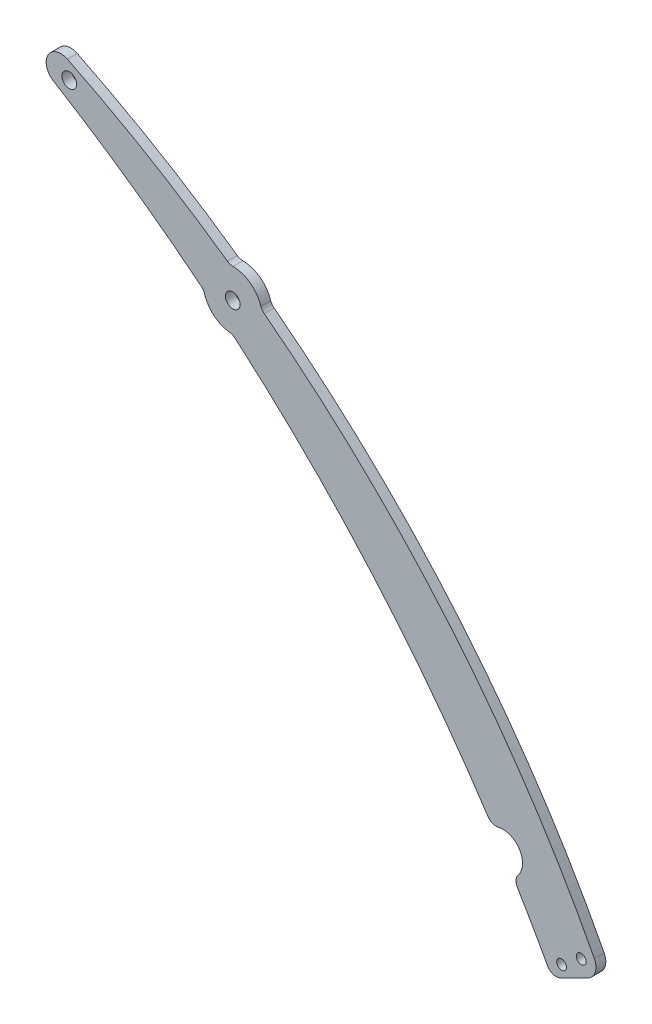
ISO-10303-21;
HEADER;
FILE_DESCRIPTION(('STEP AP214'),'2;1');
FILE_NAME('part.step','',(''),(''),'','','');
FILE_SCHEMA(('AUTOMOTIVE_DESIGN { 1 0 10303 214 1 1 1 1 }'));
ENDSEC;
DATA;
#1=APPLICATION_CONTEXT('core data for automotive mechanical design processes');
#2=APPLICATION_PROTOCOL_DEFINITION('international standard','automotive_design',2000,#1);
#3=PRODUCT_CONTEXT('',#1,'mechanical');
#4=PRODUCT('Part','Part','',(#3));
#5=PRODUCT_RELATED_PRODUCT_CATEGORY('part','',(#4));
#6=PRODUCT_DEFINITION_FORMATION('','',#4);
#7=PRODUCT_DEFINITION_CONTEXT('part definition',#1,'design');
#8=PRODUCT_DEFINITION('design','',#6,#7);
#9=PRODUCT_DEFINITION_SHAPE('','',#8);
#10=(LENGTH_UNIT() NAMED_UNIT(*) SI_UNIT(.MILLI.,.METRE.));
#11=(NAMED_UNIT(*) PLANE_ANGLE_UNIT() SI_UNIT($,.RADIAN.));
#12=(NAMED_UNIT(*) SI_UNIT($,.STERADIAN.) SOLID_ANGLE_UNIT());
#13=UNCERTAINTY_MEASURE_WITH_UNIT(LENGTH_MEASURE(1.E-05),#10,'distance_accuracy_value','');
#14=(GEOMETRIC_REPRESENTATION_CONTEXT(3) GLOBAL_UNCERTAINTY_ASSIGNED_CONTEXT((#13)) GLOBAL_UNIT_ASSIGNED_CONTEXT((#10,
#11,#12)) REPRESENTATION_CONTEXT('',''));
#15=CARTESIAN_POINT('',(0.,0.,0.));
#16=DIRECTION('',(0.,0.,1.));
#17=DIRECTION('',(1.,0.,0.));
#18=AXIS2_PLACEMENT_3D('',#15,#16,#17);
#19=CARTESIAN_POINT('',(-270.261862032767,-373.864528864417,3.));
#20=DIRECTION('',(0.,0.,-1.));
#21=DIRECTION('',(-1.,0.,0.));
#22=AXIS2_PLACEMENT_3D('',#19,#20,#21);
#23=PLANE('',#22);
#24=CARTESIAN_POINT('',(-57.9676307244706,49.9667264958207,3.));
#25=DIRECTION('',(0.,0.,1.));
#26=DIRECTION('',(1.,0.,0.));
#27=AXIS2_PLACEMENT_3D('',#24,#25,#26);
#28=CIRCLE('',#27,3.);
#29=CARTESIAN_POINT('',(-54.9676307244706,49.9667264958207,3.));
#30=VERTEX_POINT('',#29);
#31=EDGE_CURVE('E370',#30,#30,#28,.T.);
#32=ORIENTED_EDGE('',*,*,#31,.F.);
#33=EDGE_LOOP('',(#32));
#34=FACE_BOUND('',#33,.T.);
#35=CARTESIAN_POINT('',(-270.261862032767,-373.864528864417,3.));
#36=DIRECTION('',(0.,0.,1.));
#37=DIRECTION('',(-1.,0.,0.));
#38=AXIS2_PLACEMENT_3D('',#35,#36,#37);
#39=CIRCLE('',#38,480.);
#40=CARTESIAN_POINT('',(6.43434574327649,18.3588878286158,3.));
#41=VERTEX_POINT('',#40);
#42=CARTESIAN_POINT('',(-58.7344774433436,57.0138363023177,3.));
#43=VERTEX_POINT('',#42);
#44=EDGE_CURVE('E233',#41,#43,#39,.T.);
#45=ORIENTED_EDGE('',*,*,#44,.T.);
#46=CARTESIAN_POINT('',(-61.3785697507114,51.6278567377334,3.));
#47=DIRECTION('',(0.,0.,1.));
#48=DIRECTION('',(1.,0.,0.));
#49=AXIS2_PLACEMENT_3D('',#46,#47,#48);
#50=CIRCLE('',#49,6.00000000000005);
#51=CARTESIAN_POINT('',(-64.4959909119464,46.5012901183004,3.));
#52=VERTEX_POINT('',#51);
#53=EDGE_CURVE('E131',#43,#52,#50,.T.);
#54=ORIENTED_EDGE('',*,*,#53,.T.);
#55=CARTESIAN_POINT('',(-355.455299293874,-431.978261028778,3.));
#56=DIRECTION('',(0.,0.,-1.));
#57=DIRECTION('',(-1.,0.,0.));
#58=AXIS2_PLACEMENT_3D('',#55,#56,#57);
#59=CIRCLE('',#58,560.);
#60=CARTESIAN_POINT('',(-4.20028208191194,4.1638177522352,3.));
#61=VERTEX_POINT('',#60);
#62=EDGE_CURVE('E278',#52,#61,#59,.T.);
#63=ORIENTED_EDGE('',*,*,#62,.T.);
#64=CARTESIAN_POINT('',(-6.70924649056877,1.04851718951383,3.));
#65=DIRECTION('',(0.,0.,-1.));
#66=DIRECTION('',(1.,0.,0.));
#67=AXIS2_PLACEMENT_3D('',#64,#65,#66);
#68=CIRCLE('',#67,4.);
#69=CARTESIAN_POINT('',(-2.87657730560362,2.19335207656898,3.));
#70=VERTEX_POINT('',#69);
#71=EDGE_CURVE('E297',#61,#70,#68,.T.);
#72=ORIENTED_EDGE('',*,*,#71,.T.);
#73=CARTESIAN_POINT('',(8.62143024928856,5.62785673773342,3.));
#74=DIRECTION('',(0.,0.,1.));
#75=DIRECTION('',(1.,0.,0.));
#76=AXIS2_PLACEMENT_3D('',#73,#74,#75);
#77=CIRCLE('',#76,11.9999999999966);
#78=CARTESIAN_POINT('',(7.33579985629351,-6.30307593714681,3.));
#79=VERTEX_POINT('',#78);
#80=EDGE_CURVE('E294',#70,#79,#77,.T.);
#81=ORIENTED_EDGE('',*,*,#80,.T.);
#82=CARTESIAN_POINT('',(6.9072563919617,-10.2800534954413,3.));
#83=DIRECTION('',(0.,0.,-1.));
#84=DIRECTION('',(-1.,0.,0.));
#85=AXIS2_PLACEMENT_3D('',#82,#83,#84);
#86=CIRCLE('',#85,4.);
#87=CARTESIAN_POINT('',(9.51418125301089,-7.24625344124467,3.));
#88=VERTEX_POINT('',#87);
#89=EDGE_CURVE('E296',#79,#88,#86,.T.);
#90=ORIENTED_EDGE('',*,*,#89,.T.);
#91=CARTESIAN_POINT('',(-355.455299293874,-431.978261028778,3.));
#92=DIRECTION('',(0.,0.,-1.));
#93=DIRECTION('',(-1.,0.,0.));
#94=AXIS2_PLACEMENT_3D('',#91,#92,#93);
#95=CIRCLE('',#94,560.);
#96=CARTESIAN_POINT('',(112.524952292281,-124.416098002572,3.));
#97=VERTEX_POINT('',#96);
#98=EDGE_CURVE('E299',#88,#97,#95,.T.);
#99=ORIENTED_EDGE('',*,*,#98,.T.);
#100=CARTESIAN_POINT('',(115.867668375039,-122.219225409527,3.));
#101=DIRECTION('',(0.,0.,1.));
#102=DIRECTION('',(-1.,0.,0.));
#103=AXIS2_PLACEMENT_3D('',#100,#101,#102);
#104=CIRCLE('',#103,3.99999999999999);
#105=CARTESIAN_POINT('',(116.785588999789,-126.112478769721,3.));
#106=VERTEX_POINT('',#105);
#107=EDGE_CURVE('E305',#97,#106,#104,.T.);
#108=ORIENTED_EDGE('',*,*,#107,.T.);
#109=CARTESIAN_POINT('',(118.621430249289,-133.898985490108,3.));
#110=DIRECTION('',(0.,0.,-1.));
#111=DIRECTION('',(-1.,0.,0.));
#112=AXIS2_PLACEMENT_3D('',#109,#110,#111);
#113=CIRCLE('',#112,7.99999999999999);
#114=CARTESIAN_POINT('',(124.843287500004,-138.927751974219,3.));
#115=VERTEX_POINT('',#114);
#116=EDGE_CURVE('E307',#106,#115,#113,.T.);
#117=ORIENTED_EDGE('',*,*,#116,.T.);
#118=CARTESIAN_POINT('',(127.954216125362,-141.442135216274,3.));
#119=DIRECTION('',(0.,0.,1.));
#120=DIRECTION('',(1.,0.,0.));
#121=AXIS2_PLACEMENT_3D('',#118,#119,#120);
#122=CIRCLE('',#121,4.);
#123=CARTESIAN_POINT('',(124.525779845793,-143.502675115654,3.));
#124=VERTEX_POINT('',#123);
#125=EDGE_CURVE('E309',#115,#124,#122,.T.);
#126=ORIENTED_EDGE('',*,*,#125,.T.);
#127=CARTESIAN_POINT('',(-355.455299293874,-431.978261028778,3.));
#128=DIRECTION('',(0.,0.,-1.));
#129=DIRECTION('',(-1.,0.,0.));
#130=AXIS2_PLACEMENT_3D('',#127,#128,#129);
#131=CIRCLE('',#130,560.);
#132=CARTESIAN_POINT('',(136.784983157611,-164.958590719489,3.));
#133=VERTEX_POINT('',#132);
#134=EDGE_CURVE('E311',#124,#133,#131,.T.);
#135=ORIENTED_EDGE('',*,*,#134,.T.);
#136=CARTESIAN_POINT('',(140.300985175122,-163.051307360137,3.));
#137=DIRECTION('',(0.,0.,1.));
#138=DIRECTION('',(1.,0.,0.));
#139=AXIS2_PLACEMENT_3D('',#136,#137,#138);
#140=CIRCLE('',#139,4.);
#141=CARTESIAN_POINT('',(142.097183351543,-166.625334795821,3.));
#142=VERTEX_POINT('',#141);
#143=EDGE_CURVE('E313',#133,#142,#140,.T.);
#144=ORIENTED_EDGE('',*,*,#143,.T.);
#145=DIRECTION('',(0.893506858920949,0.449049544105347,0.));
#146=VECTOR('',#145,1.);
#147=CARTESIAN_POINT('',(153.226457096259,-161.032098155955,3.));
#148=LINE('',#147,#146);
#149=CARTESIAN_POINT('',(153.226457096259,-161.032098155955,3.));
#150=VERTEX_POINT('',#149);
#151=EDGE_CURVE('E315',#142,#150,#148,.T.);
#152=ORIENTED_EDGE('',*,*,#151,.T.);
#153=CARTESIAN_POINT('',(150.532159831627,-155.671057002429,3.));
#154=DIRECTION('',(0.,0.,1.));
#155=DIRECTION('',(-1.,0.,0.));
#156=AXIS2_PLACEMENT_3D('',#153,#154,#155);
#157=CIRCLE('',#156,5.99999999999998);
#158=CARTESIAN_POINT('',(155.858666437505,-152.909114320632,3.));
#159=VERTEX_POINT('',#158);
#160=EDGE_CURVE('E317',#150,#159,#157,.T.);
#161=ORIENTED_EDGE('',*,*,#160,.T.);
#162=CARTESIAN_POINT('',(-270.261862032767,-373.864528864417,3.));
#163=DIRECTION('',(0.,0.,1.));
#164=DIRECTION('',(-1.,0.,0.));
#165=AXIS2_PLACEMENT_3D('',#162,#163,#164);
#166=CIRCLE('',#165,480.);
#167=CARTESIAN_POINT('',(21.4246171394412,7.34276102931088,3.));
#168=VERTEX_POINT('',#167);
#169=EDGE_CURVE('E180',#159,#168,#166,.T.);
#170=ORIENTED_EDGE('',*,*,#169,.T.);
#171=CARTESIAN_POINT('',(23.8553377992097,10.519488445092,3.));
#172=DIRECTION('',(0.,0.,-1.));
#173=DIRECTION('',(-1.,0.,0.));
#174=AXIS2_PLACEMENT_3D('',#171,#172,#173);
#175=CIRCLE('',#174,4.);
#176=CARTESIAN_POINT('',(20.0468609117293,9.29658051825231,3.));
#177=VERTEX_POINT('',#176);
#178=EDGE_CURVE('E174',#168,#177,#175,.T.);
#179=ORIENTED_EDGE('',*,*,#178,.T.);
#180=CARTESIAN_POINT('',(8.62143024928856,5.62785673773342,3.));
#181=DIRECTION('',(0.,0.,1.));
#182=DIRECTION('',(1.,0.,0.));
#183=AXIS2_PLACEMENT_3D('',#180,#181,#182);
#184=CIRCLE('',#183,11.9999999999994);
#185=CARTESIAN_POINT('',(8.71046816837977,17.6275264102265,3.));
#186=VERTEX_POINT('',#185);
#187=EDGE_CURVE('E178',#177,#186,#184,.T.);
#188=ORIENTED_EDGE('',*,*,#187,.T.);
#189=CARTESIAN_POINT('',(8.74014747474351,21.6274163010577,3.));
#190=DIRECTION('',(0.,0.,-1.));
#191=DIRECTION('',(1.,0.,0.));
#192=AXIS2_PLACEMENT_3D('',#189,#190,#191);
#193=CIRCLE('',#192,4.);
#194=EDGE_CURVE('E58',#186,#41,#193,.T.);
#195=ORIENTED_EDGE('',*,*,#194,.T.);
#196=EDGE_LOOP('',(#45,#54,#63,#72,#81,#90,#99,#108,#117,#126,#135,#144,#152,#161,#170,#179,
#188,#195));
#197=FACE_BOUND('',#196,.T.);
#198=CARTESIAN_POINT('',(150.532159831627,-155.671057002429,3.));
#199=DIRECTION('',(0.,0.,1.));
#200=DIRECTION('',(1.,0.,0.));
#201=AXIS2_PLACEMENT_3D('',#198,#199,#200);
#202=CIRCLE('',#201,2.);
#203=CARTESIAN_POINT('',(152.532159831627,-155.671057002429,3.));
#204=VERTEX_POINT('',#203);
#205=EDGE_CURVE('E202',#204,#204,#202,.T.);
#206=ORIENTED_EDGE('',*,*,#205,.F.);
#207=EDGE_LOOP('',(#206));
#208=FACE_BOUND('',#207,.T.);
#209=CARTESIAN_POINT('',(142.532159831627,-161.671057002429,3.));
#210=DIRECTION('',(0.,0.,1.));
#211=DIRECTION('',(1.,0.,0.));
#212=AXIS2_PLACEMENT_3D('',#209,#210,#211);
#213=CIRCLE('',#212,2.);
#214=CARTESIAN_POINT('',(144.532159831627,-161.671057002429,3.));
#215=VERTEX_POINT('',#214);
#216=EDGE_CURVE('E381',#215,#215,#213,.T.);
#217=ORIENTED_EDGE('',*,*,#216,.F.);
#218=EDGE_LOOP('',(#217));
#219=FACE_BOUND('',#218,.T.);
#220=CARTESIAN_POINT('',(8.62143024928856,5.62785673773342,3.));
#221=DIRECTION('',(0.,0.,1.));
#222=DIRECTION('',(1.,0.,0.));
#223=AXIS2_PLACEMENT_3D('',#220,#221,#222);
#224=CIRCLE('',#223,3.00000000000001);
#225=CARTESIAN_POINT('',(11.6214302492886,5.62785673773342,3.));
#226=VERTEX_POINT('',#225);
#227=EDGE_CURVE('E375',#226,#226,#224,.T.);
#228=ORIENTED_EDGE('',*,*,#227,.F.);
#229=EDGE_LOOP('',(#228));
#230=FACE_BOUND('',#229,.T.);
#231=ADVANCED_FACE('F41',(#34,#197,#208,#219,#230),#23,.F.);
#232=CARTESIAN_POINT('',(-270.261862032767,-373.864528864417,-1.));
#233=DIRECTION('',(0.,0.,-1.));
#234=DIRECTION('',(-1.,0.,0.));
#235=AXIS2_PLACEMENT_3D('',#232,#233,#234);
#236=PLANE('',#235);
#237=CARTESIAN_POINT('',(-57.9676307244706,49.9667264958207,-0.999999999999997));
#238=DIRECTION('',(0.,0.,1.));
#239=DIRECTION('',(1.,0.,0.));
#240=AXIS2_PLACEMENT_3D('',#237,#238,#239);
#241=CIRCLE('',#240,3.);
#242=CARTESIAN_POINT('',(-54.9676307244706,49.9667264958207,-0.999999999999997));
#243=VERTEX_POINT('',#242);
#244=EDGE_CURVE('E368',#243,#243,#241,.T.);
#245=ORIENTED_EDGE('',*,*,#244,.T.);
#246=EDGE_LOOP('',(#245));
#247=FACE_BOUND('',#246,.T.);
#248=CARTESIAN_POINT('',(142.532159831627,-161.671057002429,-1.));
#249=DIRECTION('',(0.,0.,1.));
#250=DIRECTION('',(1.,0.,0.));
#251=AXIS2_PLACEMENT_3D('',#248,#249,#250);
#252=CIRCLE('',#251,2.);
#253=CARTESIAN_POINT('',(144.532159831627,-161.671057002429,-1.));
#254=VERTEX_POINT('',#253);
#255=EDGE_CURVE('E378',#254,#254,#252,.T.);
#256=ORIENTED_EDGE('',*,*,#255,.T.);
#257=EDGE_LOOP('',(#256));
#258=FACE_BOUND('',#257,.T.);
#259=CARTESIAN_POINT('',(-270.261862032767,-373.864528864417,-1.));
#260=DIRECTION('',(0.,0.,1.));
#261=DIRECTION('',(-1.,0.,0.));
#262=AXIS2_PLACEMENT_3D('',#259,#260,#261);
#263=CIRCLE('',#262,480.);
#264=CARTESIAN_POINT('',(6.43434574327649,18.3588878286158,-1.));
#265=VERTEX_POINT('',#264);
#266=CARTESIAN_POINT('',(-58.7344774433436,57.0138363023177,-1.));
#267=VERTEX_POINT('',#266);
#268=EDGE_CURVE('E198',#265,#267,#263,.T.);
#269=ORIENTED_EDGE('',*,*,#268,.F.);
#270=CARTESIAN_POINT('',(8.74014747474351,21.6274163010577,-1.));
#271=DIRECTION('',(0.,0.,-1.));
#272=DIRECTION('',(1.,0.,0.));
#273=AXIS2_PLACEMENT_3D('',#270,#271,#272);
#274=CIRCLE('',#273,4.);
#275=CARTESIAN_POINT('',(8.71046816837977,17.6275264102265,-1.));
#276=VERTEX_POINT('',#275);
#277=EDGE_CURVE('E123',#276,#265,#274,.T.);
#278=ORIENTED_EDGE('',*,*,#277,.F.);
#279=CARTESIAN_POINT('',(8.62143024928856,5.62785673773342,-1.));
#280=DIRECTION('',(0.,0.,1.));
#281=DIRECTION('',(1.,0.,0.));
#282=AXIS2_PLACEMENT_3D('',#279,#280,#281);
#283=CIRCLE('',#282,11.9999999999994);
#284=CARTESIAN_POINT('',(20.0468609117293,9.29658051825231,-1.));
#285=VERTEX_POINT('',#284);
#286=EDGE_CURVE('E117',#285,#276,#283,.T.);
#287=ORIENTED_EDGE('',*,*,#286,.F.);
#288=CARTESIAN_POINT('',(23.8553377992097,10.519488445092,-1.));
#289=DIRECTION('',(0.,0.,-1.));
#290=DIRECTION('',(-1.,0.,0.));
#291=AXIS2_PLACEMENT_3D('',#288,#289,#290);
#292=CIRCLE('',#291,4.);
#293=CARTESIAN_POINT('',(21.4246171394412,7.34276102931088,-1.));
#294=VERTEX_POINT('',#293);
#295=EDGE_CURVE('E188',#294,#285,#292,.T.);
#296=ORIENTED_EDGE('',*,*,#295,.F.);
#297=CARTESIAN_POINT('',(-270.261862032767,-373.864528864417,-1.));
#298=DIRECTION('',(0.,0.,1.));
#299=DIRECTION('',(-1.,0.,0.));
#300=AXIS2_PLACEMENT_3D('',#297,#298,#299);
#301=CIRCLE('',#300,480.);
#302=CARTESIAN_POINT('',(155.858666437505,-152.909114320632,-1.));
#303=VERTEX_POINT('',#302);
#304=EDGE_CURVE('E228',#303,#294,#301,.T.);
#305=ORIENTED_EDGE('',*,*,#304,.F.);
#306=CARTESIAN_POINT('',(150.532159831627,-155.671057002429,-1.));
#307=DIRECTION('',(0.,0.,1.));
#308=DIRECTION('',(-1.,0.,0.));
#309=AXIS2_PLACEMENT_3D('',#306,#307,#308);
#310=CIRCLE('',#309,5.99999999999998);
#311=CARTESIAN_POINT('',(153.226457096259,-161.032098155955,-1.));
#312=VERTEX_POINT('',#311);
#313=EDGE_CURVE('E226',#312,#303,#310,.T.);
#314=ORIENTED_EDGE('',*,*,#313,.F.);
#315=DIRECTION('',(0.893506858920949,0.449049544105347,0.));
#316=VECTOR('',#315,1.);
#317=CARTESIAN_POINT('',(153.226457096259,-161.032098155955,-1.));
#318=LINE('',#317,#316);
#319=CARTESIAN_POINT('',(142.097183351543,-166.625334795821,-1.));
#320=VERTEX_POINT('',#319);
#321=EDGE_CURVE('E224',#320,#312,#318,.T.);
#322=ORIENTED_EDGE('',*,*,#321,.F.);
#323=CARTESIAN_POINT('',(140.300985175122,-163.051307360137,-1.));
#324=DIRECTION('',(0.,0.,1.));
#325=DIRECTION('',(1.,0.,0.));
#326=AXIS2_PLACEMENT_3D('',#323,#324,#325);
#327=CIRCLE('',#326,4.);
#328=CARTESIAN_POINT('',(136.784983157611,-164.958590719489,-1.));
#329=VERTEX_POINT('',#328);
#330=EDGE_CURVE('E222',#329,#320,#327,.T.);
#331=ORIENTED_EDGE('',*,*,#330,.F.);
#332=CARTESIAN_POINT('',(-355.455299293874,-431.978261028778,-1.));
#333=DIRECTION('',(0.,0.,-1.));
#334=DIRECTION('',(-1.,0.,0.));
#335=AXIS2_PLACEMENT_3D('',#332,#333,#334);
#336=CIRCLE('',#335,560.);
#337=CARTESIAN_POINT('',(124.525779845793,-143.502675115654,-1.));
#338=VERTEX_POINT('',#337);
#339=EDGE_CURVE('E220',#338,#329,#336,.T.);
#340=ORIENTED_EDGE('',*,*,#339,.F.);
#341=CARTESIAN_POINT('',(127.954216125362,-141.442135216274,-1.));
#342=DIRECTION('',(0.,0.,1.));
#343=DIRECTION('',(1.,0.,0.));
#344=AXIS2_PLACEMENT_3D('',#341,#342,#343);
#345=CIRCLE('',#344,4.);
#346=CARTESIAN_POINT('',(124.843287500004,-138.927751974219,-1.));
#347=VERTEX_POINT('',#346);
#348=EDGE_CURVE('E218',#347,#338,#345,.T.);
#349=ORIENTED_EDGE('',*,*,#348,.F.);
#350=CARTESIAN_POINT('',(118.621430249289,-133.898985490108,-1.));
#351=DIRECTION('',(0.,0.,-1.));
#352=DIRECTION('',(-1.,0.,0.));
#353=AXIS2_PLACEMENT_3D('',#350,#351,#352);
#354=CIRCLE('',#353,7.99999999999999);
#355=CARTESIAN_POINT('',(116.785588999789,-126.112478769721,-1.));
#356=VERTEX_POINT('',#355);
#357=EDGE_CURVE('E216',#356,#347,#354,.T.);
#358=ORIENTED_EDGE('',*,*,#357,.F.);
#359=CARTESIAN_POINT('',(115.867668375039,-122.219225409527,-1.));
#360=DIRECTION('',(0.,0.,1.));
#361=DIRECTION('',(-1.,0.,0.));
#362=AXIS2_PLACEMENT_3D('',#359,#360,#361);
#363=CIRCLE('',#362,3.99999999999999);
#364=CARTESIAN_POINT('',(112.524952292281,-124.416098002572,-1.));
#365=VERTEX_POINT('',#364);
#366=EDGE_CURVE('E214',#365,#356,#363,.T.);
#367=ORIENTED_EDGE('',*,*,#366,.F.);
#368=CARTESIAN_POINT('',(-355.455299293874,-431.978261028778,-1.));
#369=DIRECTION('',(0.,0.,-1.));
#370=DIRECTION('',(-1.,0.,0.));
#371=AXIS2_PLACEMENT_3D('',#368,#369,#370);
#372=CIRCLE('',#371,560.);
#373=CARTESIAN_POINT('',(9.51418125301089,-7.24625344124467,-1.));
#374=VERTEX_POINT('',#373);
#375=EDGE_CURVE('E212',#374,#365,#372,.T.);
#376=ORIENTED_EDGE('',*,*,#375,.F.);
#377=CARTESIAN_POINT('',(6.9072563919617,-10.2800534954413,-1.));
#378=DIRECTION('',(0.,0.,-1.));
#379=DIRECTION('',(-1.,0.,0.));
#380=AXIS2_PLACEMENT_3D('',#377,#378,#379);
#381=CIRCLE('',#380,4.);
#382=CARTESIAN_POINT('',(7.33579985629351,-6.30307593714681,-1.));
#383=VERTEX_POINT('',#382);
#384=EDGE_CURVE('E210',#383,#374,#381,.T.);
#385=ORIENTED_EDGE('',*,*,#384,.F.);
#386=CARTESIAN_POINT('',(8.62143024928856,5.62785673773342,-1.));
#387=DIRECTION('',(0.,0.,1.));
#388=DIRECTION('',(1.,0.,0.));
#389=AXIS2_PLACEMENT_3D('',#386,#387,#388);
#390=CIRCLE('',#389,11.9999999999966);
#391=CARTESIAN_POINT('',(-2.87657730560362,2.19335207656898,-1.));
#392=VERTEX_POINT('',#391);
#393=EDGE_CURVE('E208',#392,#383,#390,.T.);
#394=ORIENTED_EDGE('',*,*,#393,.F.);
#395=CARTESIAN_POINT('',(-6.70924649056877,1.04851718951383,-1.));
#396=DIRECTION('',(0.,0.,-1.));
#397=DIRECTION('',(1.,0.,0.));
#398=AXIS2_PLACEMENT_3D('',#395,#396,#397);
#399=CIRCLE('',#398,4.);
#400=CARTESIAN_POINT('',(-4.20028208191194,4.1638177522352,-1.));
#401=VERTEX_POINT('',#400);
#402=EDGE_CURVE('E206',#401,#392,#399,.T.);
#403=ORIENTED_EDGE('',*,*,#402,.F.);
#404=CARTESIAN_POINT('',(-355.455299293874,-431.978261028778,-1.));
#405=DIRECTION('',(0.,0.,-1.));
#406=DIRECTION('',(-1.,0.,0.));
#407=AXIS2_PLACEMENT_3D('',#404,#405,#406);
#408=CIRCLE('',#407,560.);
#409=CARTESIAN_POINT('',(-64.4959909119464,46.5012901183004,-1.));
#410=VERTEX_POINT('',#409);
#411=EDGE_CURVE('E204',#410,#401,#408,.T.);
#412=ORIENTED_EDGE('',*,*,#411,.F.);
#413=CARTESIAN_POINT('',(-61.3785697507114,51.6278567377334,-1.));
#414=DIRECTION('',(0.,0.,1.));
#415=DIRECTION('',(1.,0.,0.));
#416=AXIS2_PLACEMENT_3D('',#413,#414,#415);
#417=CIRCLE('',#416,6.00000000000005);
#418=EDGE_CURVE('E201',#267,#410,#417,.T.);
#419=ORIENTED_EDGE('',*,*,#418,.F.);
#420=EDGE_LOOP('',(#269,#278,#287,#296,#305,#314,#322,#331,#340,#349,#358,#367,#376,#385,#394,
#403,#412,#419));
#421=FACE_BOUND('',#420,.T.);
#422=CARTESIAN_POINT('',(150.532159831627,-155.671057002429,-1.));
#423=DIRECTION('',(0.,0.,1.));
#424=DIRECTION('',(1.,0.,0.));
#425=AXIS2_PLACEMENT_3D('',#422,#423,#424);
#426=CIRCLE('',#425,2.);
#427=CARTESIAN_POINT('',(152.532159831627,-155.671057002429,-1.));
#428=VERTEX_POINT('',#427);
#429=EDGE_CURVE('E384',#428,#428,#426,.T.);
#430=ORIENTED_EDGE('',*,*,#429,.T.);
#431=EDGE_LOOP('',(#430));
#432=FACE_BOUND('',#431,.T.);
#433=CARTESIAN_POINT('',(8.62143024928856,5.62785673773342,-1.));
#434=DIRECTION('',(0.,0.,1.));
#435=DIRECTION('',(1.,0.,0.));
#436=AXIS2_PLACEMENT_3D('',#433,#434,#435);
#437=CIRCLE('',#436,3.00000000000001);
#438=CARTESIAN_POINT('',(11.6214302492886,5.62785673773342,-1.));
#439=VERTEX_POINT('',#438);
#440=EDGE_CURVE('E372',#439,#439,#437,.T.);
#441=ORIENTED_EDGE('',*,*,#440,.T.);
#442=EDGE_LOOP('',(#441));
#443=FACE_BOUND('',#442,.T.);
#444=ADVANCED_FACE('F282',(#247,#258,#421,#432,#443),#236,.T.);
#445=CARTESIAN_POINT('',(-270.261862032767,-373.864528864417,3.));
#446=DIRECTION('',(0.,0.,-1.));
#447=DIRECTION('',(-1.,0.,0.));
#448=AXIS2_PLACEMENT_3D('',#445,#446,#447);
#449=CYLINDRICAL_SURFACE('',#448,480.);
#450=ORIENTED_EDGE('',*,*,#268,.T.);
#451=DIRECTION('',(0.,0.,-1.));
#452=VECTOR('',#451,1.);
#453=CARTESIAN_POINT('',(-58.7344774433436,57.0138363023177,3.));
#454=LINE('',#453,#452);
#455=EDGE_CURVE('E11',#43,#267,#454,.T.);
#456=ORIENTED_EDGE('',*,*,#455,.F.);
#457=ORIENTED_EDGE('',*,*,#44,.F.);
#458=DIRECTION('',(0.,0.,-1.));
#459=VECTOR('',#458,1.);
#460=CARTESIAN_POINT('',(6.43434574327649,18.3588878286158,3.));
#461=LINE('',#460,#459);
#462=EDGE_CURVE('E194',#41,#265,#461,.T.);
#463=ORIENTED_EDGE('',*,*,#462,.T.);
#464=EDGE_LOOP('',(#450,#456,#457,#463));
#465=FACE_BOUND('',#464,.T.);
#466=ADVANCED_FACE('F43',(#465),#449,.T.);
#467=CARTESIAN_POINT('',(-61.3785697507114,51.6278567377334,3.));
#468=DIRECTION('',(0.,0.,-1.));
#469=DIRECTION('',(-1.,0.,0.));
#470=AXIS2_PLACEMENT_3D('',#467,#468,#469);
#471=CYLINDRICAL_SURFACE('',#470,6.00000000000005);
#472=ORIENTED_EDGE('',*,*,#418,.T.);
#473=DIRECTION('',(0.,0.,-1.));
#474=VECTOR('',#473,1.);
#475=CARTESIAN_POINT('',(-64.4959909119464,46.5012901183004,3.));
#476=LINE('',#475,#474);
#477=EDGE_CURVE('E50',#52,#410,#476,.T.);
#478=ORIENTED_EDGE('',*,*,#477,.F.);
#479=ORIENTED_EDGE('',*,*,#53,.F.);
#480=ORIENTED_EDGE('',*,*,#455,.T.);
#481=EDGE_LOOP('',(#472,#478,#479,#480));
#482=FACE_BOUND('',#481,.T.);
#483=ADVANCED_FACE('F583',(#482),#471,.T.);
#484=CARTESIAN_POINT('',(-355.455299293874,-431.978261028778,3.));
#485=DIRECTION('',(0.,0.,-1.));
#486=DIRECTION('',(-1.,0.,0.));
#487=AXIS2_PLACEMENT_3D('',#484,#485,#486);
#488=CYLINDRICAL_SURFACE('',#487,560.);
#489=ORIENTED_EDGE('',*,*,#411,.T.);
#490=DIRECTION('',(0.,0.,-1.));
#491=VECTOR('',#490,1.);
#492=CARTESIAN_POINT('',(-4.20028208191194,4.1638177522352,3.));
#493=LINE('',#492,#491);
#494=EDGE_CURVE('E270',#61,#401,#493,.T.);
#495=ORIENTED_EDGE('',*,*,#494,.F.);
#496=ORIENTED_EDGE('',*,*,#62,.F.);
#497=ORIENTED_EDGE('',*,*,#477,.T.);
#498=EDGE_LOOP('',(#489,#495,#496,#497));
#499=FACE_BOUND('',#498,.T.);
#500=ADVANCED_FACE('F276',(#499),#488,.F.);
#501=CARTESIAN_POINT('',(-6.70924649056877,1.04851718951383,3.));
#502=DIRECTION('',(0.,0.,-1.));
#503=DIRECTION('',(-1.,0.,0.));
#504=AXIS2_PLACEMENT_3D('',#501,#502,#503);
#505=CYLINDRICAL_SURFACE('',#504,4.);
#506=ORIENTED_EDGE('',*,*,#402,.T.);
#507=DIRECTION('',(0.,0.,-1.));
#508=VECTOR('',#507,1.);
#509=CARTESIAN_POINT('',(-2.87657730560362,2.19335207656898,3.));
#510=LINE('',#509,#508);
#511=EDGE_CURVE('E267',#70,#392,#510,.T.);
#512=ORIENTED_EDGE('',*,*,#511,.F.);
#513=ORIENTED_EDGE('',*,*,#71,.F.);
#514=ORIENTED_EDGE('',*,*,#494,.T.);
#515=EDGE_LOOP('',(#506,#512,#513,#514));
#516=FACE_BOUND('',#515,.T.);
#517=ADVANCED_FACE('F288',(#516),#505,.F.);
#518=CARTESIAN_POINT('',(8.62143024928856,5.62785673773342,3.));
#519=DIRECTION('',(0.,0.,-1.));
#520=DIRECTION('',(-1.,0.,0.));
#521=AXIS2_PLACEMENT_3D('',#518,#519,#520);
#522=CYLINDRICAL_SURFACE('',#521,11.9999999999966);
#523=ORIENTED_EDGE('',*,*,#393,.T.);
#524=DIRECTION('',(0.,0.,-1.));
#525=VECTOR('',#524,1.);
#526=CARTESIAN_POINT('',(7.33579985629351,-6.30307593714681,3.));
#527=LINE('',#526,#525);
#528=EDGE_CURVE('E264',#79,#383,#527,.T.);
#529=ORIENTED_EDGE('',*,*,#528,.F.);
#530=ORIENTED_EDGE('',*,*,#80,.F.);
#531=ORIENTED_EDGE('',*,*,#511,.T.);
#532=EDGE_LOOP('',(#523,#529,#530,#531));
#533=FACE_BOUND('',#532,.T.);
#534=ADVANCED_FACE('F292',(#533),#522,.T.);
#535=CARTESIAN_POINT('',(6.9072563919617,-10.2800534954413,3.));
#536=DIRECTION('',(0.,0.,-1.));
#537=DIRECTION('',(-1.,0.,0.));
#538=AXIS2_PLACEMENT_3D('',#535,#536,#537);
#539=CYLINDRICAL_SURFACE('',#538,4.);
#540=ORIENTED_EDGE('',*,*,#384,.T.);
#541=DIRECTION('',(0.,0.,-1.));
#542=VECTOR('',#541,1.);
#543=CARTESIAN_POINT('',(9.51418125301089,-7.24625344124467,3.));
#544=LINE('',#543,#542);
#545=EDGE_CURVE('E261',#88,#374,#544,.T.);
#546=ORIENTED_EDGE('',*,*,#545,.F.);
#547=ORIENTED_EDGE('',*,*,#89,.F.);
#548=ORIENTED_EDGE('',*,*,#528,.T.);
#549=EDGE_LOOP('',(#540,#546,#547,#548));
#550=FACE_BOUND('',#549,.T.);
#551=ADVANCED_FACE('F548',(#550),#539,.F.);
#552=CARTESIAN_POINT('',(-355.455299293874,-431.978261028778,3.));
#553=DIRECTION('',(0.,0.,-1.));
#554=DIRECTION('',(-1.,0.,0.));
#555=AXIS2_PLACEMENT_3D('',#552,#553,#554);
#556=CYLINDRICAL_SURFACE('',#555,560.);
#557=ORIENTED_EDGE('',*,*,#375,.T.);
#558=DIRECTION('',(0.,0.,-1.));
#559=VECTOR('',#558,1.);
#560=CARTESIAN_POINT('',(112.524952292281,-124.416098002572,3.));
#561=LINE('',#560,#559);
#562=EDGE_CURVE('E258',#97,#365,#561,.T.);
#563=ORIENTED_EDGE('',*,*,#562,.F.);
#564=ORIENTED_EDGE('',*,*,#98,.F.);
#565=ORIENTED_EDGE('',*,*,#545,.T.);
#566=EDGE_LOOP('',(#557,#563,#564,#565));
#567=FACE_BOUND('',#566,.T.);
#568=ADVANCED_FACE('F538',(#567),#556,.F.);
#569=CARTESIAN_POINT('',(115.867668375039,-122.219225409527,3.));
#570=DIRECTION('',(0.,0.,-1.));
#571=DIRECTION('',(-1.,0.,0.));
#572=AXIS2_PLACEMENT_3D('',#569,#570,#571);
#573=CYLINDRICAL_SURFACE('',#572,3.99999999999999);
#574=ORIENTED_EDGE('',*,*,#366,.T.);
#575=DIRECTION('',(0.,0.,-1.));
#576=VECTOR('',#575,1.);
#577=CARTESIAN_POINT('',(116.785588999789,-126.112478769721,3.));
#578=LINE('',#577,#576);
#579=EDGE_CURVE('E255',#106,#356,#578,.T.);
#580=ORIENTED_EDGE('',*,*,#579,.F.);
#581=ORIENTED_EDGE('',*,*,#107,.F.);
#582=ORIENTED_EDGE('',*,*,#562,.T.);
#583=EDGE_LOOP('',(#574,#580,#581,#582));
#584=FACE_BOUND('',#583,.T.);
#585=ADVANCED_FACE('F528',(#584),#573,.T.);
#586=CARTESIAN_POINT('',(118.621430249289,-133.898985490108,3.));
#587=DIRECTION('',(0.,0.,-1.));
#588=DIRECTION('',(-1.,0.,0.));
#589=AXIS2_PLACEMENT_3D('',#586,#587,#588);
#590=CYLINDRICAL_SURFACE('',#589,7.99999999999999);
#591=ORIENTED_EDGE('',*,*,#357,.T.);
#592=DIRECTION('',(0.,0.,-1.));
#593=VECTOR('',#592,1.);
#594=CARTESIAN_POINT('',(124.843287500004,-138.927751974219,3.));
#595=LINE('',#594,#593);
#596=EDGE_CURVE('E252',#115,#347,#595,.T.);
#597=ORIENTED_EDGE('',*,*,#596,.F.);
#598=ORIENTED_EDGE('',*,*,#116,.F.);
#599=ORIENTED_EDGE('',*,*,#579,.T.);
#600=EDGE_LOOP('',(#591,#597,#598,#599));
#601=FACE_BOUND('',#600,.T.);
#602=ADVANCED_FACE('F518',(#601),#590,.F.);
#603=CARTESIAN_POINT('',(127.954216125362,-141.442135216274,3.));
#604=DIRECTION('',(0.,0.,-1.));
#605=DIRECTION('',(-1.,0.,0.));
#606=AXIS2_PLACEMENT_3D('',#603,#604,#605);
#607=CYLINDRICAL_SURFACE('',#606,4.);
#608=ORIENTED_EDGE('',*,*,#348,.T.);
#609=DIRECTION('',(0.,0.,-1.));
#610=VECTOR('',#609,1.);
#611=CARTESIAN_POINT('',(124.525779845793,-143.502675115654,3.));
#612=LINE('',#611,#610);
#613=EDGE_CURVE('E249',#124,#338,#612,.T.);
#614=ORIENTED_EDGE('',*,*,#613,.F.);
#615=ORIENTED_EDGE('',*,*,#125,.F.);
#616=ORIENTED_EDGE('',*,*,#596,.T.);
#617=EDGE_LOOP('',(#608,#614,#615,#616));
#618=FACE_BOUND('',#617,.T.);
#619=ADVANCED_FACE('F508',(#618),#607,.T.);
#620=CARTESIAN_POINT('',(-355.455299293874,-431.978261028778,3.));
#621=DIRECTION('',(0.,0.,-1.));
#622=DIRECTION('',(-1.,0.,0.));
#623=AXIS2_PLACEMENT_3D('',#620,#621,#622);
#624=CYLINDRICAL_SURFACE('',#623,560.);
#625=ORIENTED_EDGE('',*,*,#339,.T.);
#626=DIRECTION('',(0.,0.,-1.));
#627=VECTOR('',#626,1.);
#628=CARTESIAN_POINT('',(136.784983157611,-164.958590719489,3.));
#629=LINE('',#628,#627);
#630=EDGE_CURVE('E246',#133,#329,#629,.T.);
#631=ORIENTED_EDGE('',*,*,#630,.F.);
#632=ORIENTED_EDGE('',*,*,#134,.F.);
#633=ORIENTED_EDGE('',*,*,#613,.T.);
#634=EDGE_LOOP('',(#625,#631,#632,#633));
#635=FACE_BOUND('',#634,.T.);
#636=ADVANCED_FACE('F498',(#635),#624,.F.);
#637=CARTESIAN_POINT('',(140.300985175122,-163.051307360137,3.));
#638=DIRECTION('',(0.,0.,-1.));
#639=DIRECTION('',(-1.,0.,0.));
#640=AXIS2_PLACEMENT_3D('',#637,#638,#639);
#641=CYLINDRICAL_SURFACE('',#640,4.);
#642=ORIENTED_EDGE('',*,*,#330,.T.);
#643=DIRECTION('',(0.,0.,-1.));
#644=VECTOR('',#643,1.);
#645=CARTESIAN_POINT('',(142.097183351543,-166.625334795821,3.));
#646=LINE('',#645,#644);
#647=EDGE_CURVE('E243',#142,#320,#646,.T.);
#648=ORIENTED_EDGE('',*,*,#647,.F.);
#649=ORIENTED_EDGE('',*,*,#143,.F.);
#650=ORIENTED_EDGE('',*,*,#630,.T.);
#651=EDGE_LOOP('',(#642,#648,#649,#650));
#652=FACE_BOUND('',#651,.T.);
#653=ADVANCED_FACE('F488',(#652),#641,.T.);
#654=CARTESIAN_POINT('',(153.226457096259,-161.032098155955,3.));
#655=DIRECTION('',(-0.449049544105347,0.893506858920949,0.));
#656=DIRECTION('',(-0.893506858920949,-0.449049544105347,0.));
#657=AXIS2_PLACEMENT_3D('',#654,#655,#656);
#658=PLANE('',#657);
#659=ORIENTED_EDGE('',*,*,#321,.T.);
#660=DIRECTION('',(0.,0.,-1.));
#661=VECTOR('',#660,1.);
#662=CARTESIAN_POINT('',(153.226457096259,-161.032098155955,3.));
#663=LINE('',#662,#661);
#664=EDGE_CURVE('E240',#150,#312,#663,.T.);
#665=ORIENTED_EDGE('',*,*,#664,.F.);
#666=ORIENTED_EDGE('',*,*,#151,.F.);
#667=ORIENTED_EDGE('',*,*,#647,.T.);
#668=EDGE_LOOP('',(#659,#665,#666,#667));
#669=FACE_BOUND('',#668,.T.);
#670=ADVANCED_FACE('F479',(#669),#658,.F.);
#671=CARTESIAN_POINT('',(150.532159831627,-155.671057002429,3.));
#672=DIRECTION('',(0.,0.,-1.));
#673=DIRECTION('',(-1.,0.,0.));
#674=AXIS2_PLACEMENT_3D('',#671,#672,#673);
#675=CYLINDRICAL_SURFACE('',#674,5.99999999999998);
#676=ORIENTED_EDGE('',*,*,#313,.T.);
#677=DIRECTION('',(0.,0.,-1.));
#678=VECTOR('',#677,1.);
#679=CARTESIAN_POINT('',(155.858666437505,-152.909114320632,3.));
#680=LINE('',#679,#678);
#681=EDGE_CURVE('E237',#159,#303,#680,.T.);
#682=ORIENTED_EDGE('',*,*,#681,.F.);
#683=ORIENTED_EDGE('',*,*,#160,.F.);
#684=ORIENTED_EDGE('',*,*,#664,.T.);
#685=EDGE_LOOP('',(#676,#682,#683,#684));
#686=FACE_BOUND('',#685,.T.);
#687=ADVANCED_FACE('F323',(#686),#675,.T.);
#688=CARTESIAN_POINT('',(-270.261862032767,-373.864528864417,3.));
#689=DIRECTION('',(0.,0.,-1.));
#690=DIRECTION('',(-1.,0.,0.));
#691=AXIS2_PLACEMENT_3D('',#688,#689,#690);
#692=CYLINDRICAL_SURFACE('',#691,480.);
#693=ORIENTED_EDGE('',*,*,#304,.T.);
#694=DIRECTION('',(0.,0.,-1.));
#695=VECTOR('',#694,1.);
#696=CARTESIAN_POINT('',(21.4246171394412,7.34276102931088,3.));
#697=LINE('',#696,#695);
#698=EDGE_CURVE('E189',#168,#294,#697,.T.);
#699=ORIENTED_EDGE('',*,*,#698,.F.);
#700=ORIENTED_EDGE('',*,*,#169,.F.);
#701=ORIENTED_EDGE('',*,*,#681,.T.);
#702=EDGE_LOOP('',(#693,#699,#700,#701));
#703=FACE_BOUND('',#702,.T.);
#704=ADVANCED_FACE('F327',(#703),#692,.T.);
#705=CARTESIAN_POINT('',(23.8553377992097,10.519488445092,3.));
#706=DIRECTION('',(0.,0.,-1.));
#707=DIRECTION('',(-1.,0.,0.));
#708=AXIS2_PLACEMENT_3D('',#705,#706,#707);
#709=CYLINDRICAL_SURFACE('',#708,4.);
#710=ORIENTED_EDGE('',*,*,#295,.T.);
#711=DIRECTION('',(0.,0.,-1.));
#712=VECTOR('',#711,1.);
#713=CARTESIAN_POINT('',(20.0468609117293,9.29658051825231,3.));
#714=LINE('',#713,#712);
#715=EDGE_CURVE('E185',#177,#285,#714,.T.);
#716=ORIENTED_EDGE('',*,*,#715,.F.);
#717=ORIENTED_EDGE('',*,*,#178,.F.);
#718=ORIENTED_EDGE('',*,*,#698,.T.);
#719=EDGE_LOOP('',(#710,#716,#717,#718));
#720=FACE_BOUND('',#719,.T.);
#721=ADVANCED_FACE('F186',(#720),#709,.F.);
#722=CARTESIAN_POINT('',(8.62143024928856,5.62785673773342,3.));
#723=DIRECTION('',(0.,0.,-1.));
#724=DIRECTION('',(-1.,0.,0.));
#725=AXIS2_PLACEMENT_3D('',#722,#723,#724);
#726=CYLINDRICAL_SURFACE('',#725,11.9999999999994);
#727=ORIENTED_EDGE('',*,*,#286,.T.);
#728=DIRECTION('',(0.,0.,-1.));
#729=VECTOR('',#728,1.);
#730=CARTESIAN_POINT('',(8.71046816837977,17.6275264102265,3.));
#731=LINE('',#730,#729);
#732=EDGE_CURVE('E190',#186,#276,#731,.T.);
#733=ORIENTED_EDGE('',*,*,#732,.F.);
#734=ORIENTED_EDGE('',*,*,#187,.F.);
#735=ORIENTED_EDGE('',*,*,#715,.T.);
#736=EDGE_LOOP('',(#727,#733,#734,#735));
#737=FACE_BOUND('',#736,.T.);
#738=ADVANCED_FACE('F192',(#737),#726,.T.);
#739=CARTESIAN_POINT('',(8.74014747474351,21.6274163010577,3.));
#740=DIRECTION('',(0.,0.,-1.));
#741=DIRECTION('',(-1.,0.,0.));
#742=AXIS2_PLACEMENT_3D('',#739,#740,#741);
#743=CYLINDRICAL_SURFACE('',#742,4.);
#744=ORIENTED_EDGE('',*,*,#277,.T.);
#745=ORIENTED_EDGE('',*,*,#462,.F.);
#746=ORIENTED_EDGE('',*,*,#194,.F.);
#747=ORIENTED_EDGE('',*,*,#732,.T.);
#748=EDGE_LOOP('',(#744,#745,#746,#747));
#749=FACE_BOUND('',#748,.T.);
#750=ADVANCED_FACE('F331',(#749),#743,.F.);
#751=CARTESIAN_POINT('',(150.532159831627,-155.671057002429,3.));
#752=DIRECTION('',(0.,0.,-1.));
#753=DIRECTION('',(-1.,0.,0.));
#754=AXIS2_PLACEMENT_3D('',#751,#752,#753);
#755=CYLINDRICAL_SURFACE('',#754,2.);
#756=ORIENTED_EDGE('',*,*,#205,.T.);
#757=EDGE_LOOP('',(#756));
#758=FACE_BOUND('',#757,.T.);
#759=ORIENTED_EDGE('',*,*,#429,.F.);
#760=EDGE_LOOP('',(#759));
#761=FACE_BOUND('',#760,.T.);
#762=ADVANCED_FACE('F333',(#758,#761),#755,.F.);
#763=CARTESIAN_POINT('',(142.532159831627,-161.671057002429,3.));
#764=DIRECTION('',(0.,0.,-1.));
#765=DIRECTION('',(-1.,0.,0.));
#766=AXIS2_PLACEMENT_3D('',#763,#764,#765);
#767=CYLINDRICAL_SURFACE('',#766,2.);
#768=ORIENTED_EDGE('',*,*,#216,.T.);
#769=EDGE_LOOP('',(#768));
#770=FACE_BOUND('',#769,.T.);
#771=ORIENTED_EDGE('',*,*,#255,.F.);
#772=EDGE_LOOP('',(#771));
#773=FACE_BOUND('',#772,.T.);
#774=ADVANCED_FACE('F339',(#770,#773),#767,.F.);
#775=CARTESIAN_POINT('',(8.62143024928856,5.62785673773342,3.));
#776=DIRECTION('',(0.,0.,-1.));
#777=DIRECTION('',(-1.,0.,0.));
#778=AXIS2_PLACEMENT_3D('',#775,#776,#777);
#779=CYLINDRICAL_SURFACE('',#778,3.00000000000001);
#780=ORIENTED_EDGE('',*,*,#227,.T.);
#781=EDGE_LOOP('',(#780));
#782=FACE_BOUND('',#781,.T.);
#783=ORIENTED_EDGE('',*,*,#440,.F.);
#784=EDGE_LOOP('',(#783));
#785=FACE_BOUND('',#784,.T.);
#786=ADVANCED_FACE('F356',(#782,#785),#779,.F.);
#787=CARTESIAN_POINT('',(-57.9676307244706,49.9667264958207,-0.999999999999997));
#788=DIRECTION('',(0.,0.,1.));
#789=DIRECTION('',(1.,0.,0.));
#790=AXIS2_PLACEMENT_3D('',#787,#788,#789);
#791=CYLINDRICAL_SURFACE('',#790,3.);
#792=ORIENTED_EDGE('',*,*,#244,.F.);
#793=EDGE_LOOP('',(#792));
#794=FACE_BOUND('',#793,.T.);
#795=ORIENTED_EDGE('',*,*,#31,.T.);
#796=EDGE_LOOP('',(#795));
#797=FACE_BOUND('',#796,.T.);
#798=ADVANCED_FACE('F359',(#794,#797),#791,.F.);
#799=CLOSED_SHELL('',(#231,#444,#466,#483,#500,#517,#534,#551,#568,#585,#602,#619,#636,#653,
#670,#687,#704,#721,#738,#750,#762,#774,#786,#798));
#800=MANIFOLD_SOLID_BREP('B2',#799);
#801=ADVANCED_BREP_SHAPE_REPRESENTATION('',(#18,#800),#14);
#802=SHAPE_DEFINITION_REPRESENTATION(#9,#801);
ENDSEC;
END-ISO-10303-21;
